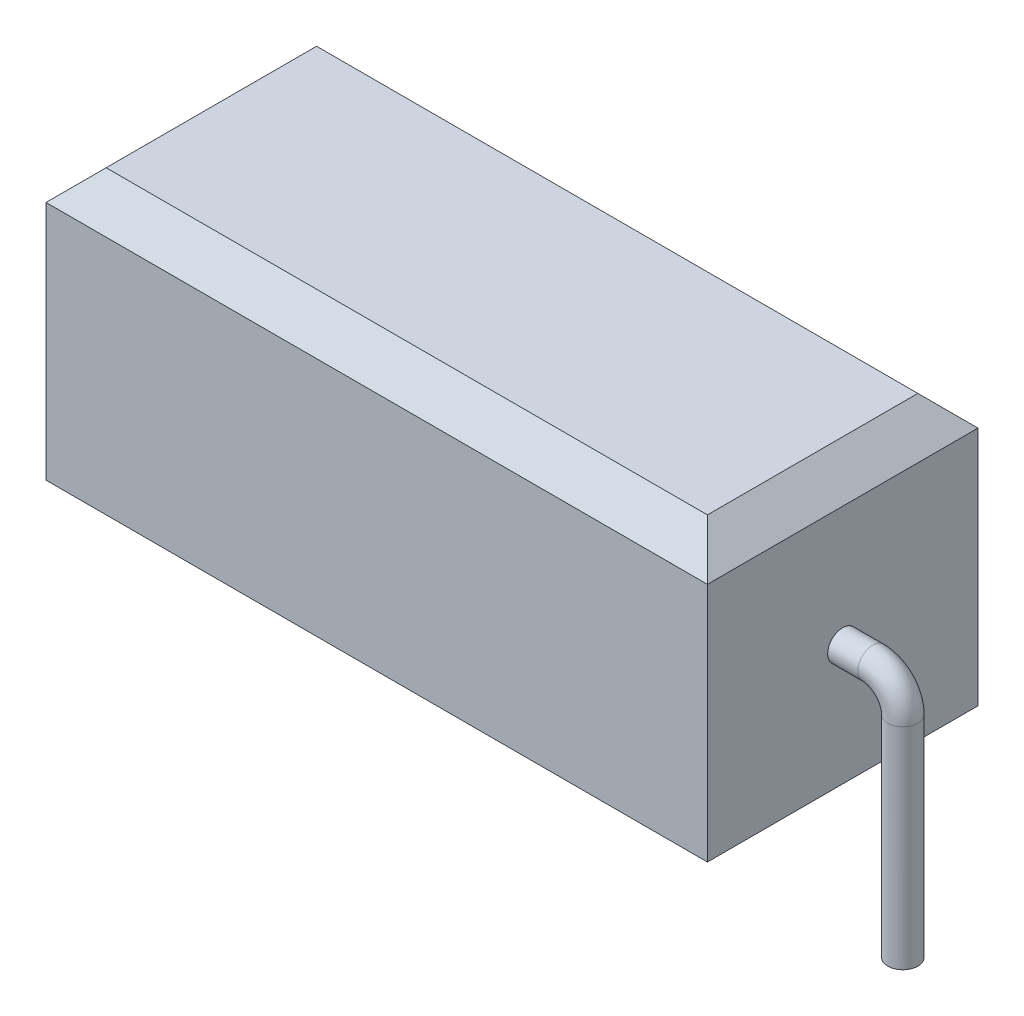
ISO-10303-21;
HEADER;
FILE_DESCRIPTION(('STEP AP214'),'2;1');
FILE_NAME('part.step','',(''),(''),'','','');
FILE_SCHEMA(('AUTOMOTIVE_DESIGN { 1 0 10303 214 1 1 1 1 }'));
ENDSEC;
DATA;
#1=APPLICATION_CONTEXT('core data for automotive mechanical design processes');
#2=APPLICATION_PROTOCOL_DEFINITION('international standard','automotive_design',2000,#1);
#3=PRODUCT_CONTEXT('',#1,'mechanical');
#4=PRODUCT('Part','Part','',(#3));
#5=PRODUCT_RELATED_PRODUCT_CATEGORY('part','',(#4));
#6=PRODUCT_DEFINITION_FORMATION('','',#4);
#7=PRODUCT_DEFINITION_CONTEXT('part definition',#1,'design');
#8=PRODUCT_DEFINITION('design','',#6,#7);
#9=PRODUCT_DEFINITION_SHAPE('','',#8);
#10=(LENGTH_UNIT() NAMED_UNIT(*) SI_UNIT(.MILLI.,.METRE.));
#11=(NAMED_UNIT(*) PLANE_ANGLE_UNIT() SI_UNIT($,.RADIAN.));
#12=(NAMED_UNIT(*) SI_UNIT($,.STERADIAN.) SOLID_ANGLE_UNIT());
#13=UNCERTAINTY_MEASURE_WITH_UNIT(LENGTH_MEASURE(1.E-05),#10,'distance_accuracy_value','');
#14=(GEOMETRIC_REPRESENTATION_CONTEXT(3) GLOBAL_UNCERTAINTY_ASSIGNED_CONTEXT((#13)) GLOBAL_UNIT_ASSIGNED_CONTEXT((#10,
#11,#12)) REPRESENTATION_CONTEXT('',''));
#15=CARTESIAN_POINT('',(0.,0.,0.));
#16=DIRECTION('',(0.,0.,1.));
#17=DIRECTION('',(1.,0.,0.));
#18=AXIS2_PLACEMENT_3D('',#15,#16,#17);
#19=CARTESIAN_POINT('',(11.,5.,4.5));
#20=DIRECTION('',(-1.,0.,0.));
#21=DIRECTION('',(0.,0.,1.));
#22=AXIS2_PLACEMENT_3D('',#19,#20,#21);
#23=PLANE('',#22);
#24=CARTESIAN_POINT('',(11.,0.,0.));
#25=DIRECTION('',(-1.,0.,0.));
#26=DIRECTION('',(0.,0.,1.));
#27=AXIS2_PLACEMENT_3D('',#24,#25,#26);
#28=CIRCLE('',#27,0.5);
#29=CARTESIAN_POINT('',(11.,0.,0.5));
#30=VERTEX_POINT('',#29);
#31=EDGE_CURVE('E76',#30,#30,#28,.F.);
#32=ORIENTED_EDGE('',*,*,#31,.F.);
#33=EDGE_LOOP('',(#32));
#34=FACE_BOUND('',#33,.T.);
#35=DIRECTION('',(0.,-1.,0.));
#36=VECTOR('',#35,1.);
#37=CARTESIAN_POINT('',(11.,5.,4.5));
#38=LINE('',#37,#36);
#39=CARTESIAN_POINT('',(11.,3.99999999999999,4.5));
#40=VERTEX_POINT('',#39);
#41=CARTESIAN_POINT('',(11.,-4.,4.5));
#42=VERTEX_POINT('',#41);
#43=EDGE_CURVE('E201',#40,#42,#38,.T.);
#44=ORIENTED_EDGE('',*,*,#43,.T.);
#45=DIRECTION('',(0.,0.,-1.));
#46=VECTOR('',#45,1.);
#47=CARTESIAN_POINT('',(11.,-4.,-4.5));
#48=LINE('',#47,#46);
#49=CARTESIAN_POINT('',(11.,-4.,-4.5));
#50=VERTEX_POINT('',#49);
#51=EDGE_CURVE('E217',#42,#50,#48,.T.);
#52=ORIENTED_EDGE('',*,*,#51,.T.);
#53=DIRECTION('',(0.,-1.,0.));
#54=VECTOR('',#53,1.);
#55=CARTESIAN_POINT('',(11.,5.,-4.5));
#56=LINE('',#55,#54);
#57=CARTESIAN_POINT('',(11.,3.99999999999999,-4.5));
#58=VERTEX_POINT('',#57);
#59=EDGE_CURVE('E157',#58,#50,#56,.T.);
#60=ORIENTED_EDGE('',*,*,#59,.F.);
#61=DIRECTION('',(0.,0.,1.));
#62=VECTOR('',#61,1.);
#63=CARTESIAN_POINT('',(11.,3.99999999999999,4.5));
#64=LINE('',#63,#62);
#65=EDGE_CURVE('E222',#58,#40,#64,.T.);
#66=ORIENTED_EDGE('',*,*,#65,.T.);
#67=EDGE_LOOP('',(#44,#52,#60,#66));
#68=FACE_BOUND('',#67,.T.);
#69=ADVANCED_FACE('F66',(#34,#68),#23,.F.);
#70=CARTESIAN_POINT('',(-11.,5.,-4.5));
#71=DIRECTION('',(0.,0.,1.));
#72=DIRECTION('',(1.,0.,0.));
#73=AXIS2_PLACEMENT_3D('',#70,#71,#72);
#74=PLANE('',#73);
#75=ORIENTED_EDGE('',*,*,#59,.T.);
#76=DIRECTION('',(-1.,0.,0.));
#77=VECTOR('',#76,1.);
#78=CARTESIAN_POINT('',(-11.,-4.,-4.5));
#79=LINE('',#78,#77);
#80=CARTESIAN_POINT('',(-11.,-4.,-4.5));
#81=VERTEX_POINT('',#80);
#82=EDGE_CURVE('E155',#50,#81,#79,.T.);
#83=ORIENTED_EDGE('',*,*,#82,.T.);
#84=DIRECTION('',(0.,-1.,0.));
#85=VECTOR('',#84,1.);
#86=CARTESIAN_POINT('',(-11.,5.,-4.5));
#87=LINE('',#86,#85);
#88=CARTESIAN_POINT('',(-11.,3.99999999999999,-4.5));
#89=VERTEX_POINT('',#88);
#90=EDGE_CURVE('E137',#89,#81,#87,.T.);
#91=ORIENTED_EDGE('',*,*,#90,.F.);
#92=DIRECTION('',(1.,0.,0.));
#93=VECTOR('',#92,1.);
#94=CARTESIAN_POINT('',(-11.,3.99999999999999,-4.5));
#95=LINE('',#94,#93);
#96=EDGE_CURVE('E152',#89,#58,#95,.T.);
#97=ORIENTED_EDGE('',*,*,#96,.T.);
#98=EDGE_LOOP('',(#75,#83,#91,#97));
#99=FACE_BOUND('',#98,.T.);
#100=ADVANCED_FACE('F151',(#99),#74,.F.);
#101=CARTESIAN_POINT('',(-11.,5.,4.5));
#102=DIRECTION('',(1.,0.,0.));
#103=DIRECTION('',(0.,0.,-1.));
#104=AXIS2_PLACEMENT_3D('',#101,#102,#103);
#105=PLANE('',#104);
#106=CARTESIAN_POINT('',(-11.,0.,0.));
#107=DIRECTION('',(1.,0.,0.));
#108=DIRECTION('',(0.,0.,-1.));
#109=AXIS2_PLACEMENT_3D('',#106,#107,#108);
#110=CIRCLE('',#109,0.5);
#111=CARTESIAN_POINT('',(-11.,0.,-0.5));
#112=VERTEX_POINT('',#111);
#113=EDGE_CURVE('E12',#112,#112,#110,.F.);
#114=ORIENTED_EDGE('',*,*,#113,.F.);
#115=EDGE_LOOP('',(#114));
#116=FACE_BOUND('',#115,.T.);
#117=ORIENTED_EDGE('',*,*,#90,.T.);
#118=DIRECTION('',(0.,0.,1.));
#119=VECTOR('',#118,1.);
#120=CARTESIAN_POINT('',(-11.,-4.,4.5));
#121=LINE('',#120,#119);
#122=CARTESIAN_POINT('',(-11.,-4.,4.5));
#123=VERTEX_POINT('',#122);
#124=EDGE_CURVE('E144',#81,#123,#121,.T.);
#125=ORIENTED_EDGE('',*,*,#124,.T.);
#126=DIRECTION('',(0.,-1.,0.));
#127=VECTOR('',#126,1.);
#128=CARTESIAN_POINT('',(-11.,5.,4.5));
#129=LINE('',#128,#127);
#130=CARTESIAN_POINT('',(-11.,3.99999999999999,4.5));
#131=VERTEX_POINT('',#130);
#132=EDGE_CURVE('E139',#131,#123,#129,.T.);
#133=ORIENTED_EDGE('',*,*,#132,.F.);
#134=DIRECTION('',(0.,0.,-1.));
#135=VECTOR('',#134,1.);
#136=CARTESIAN_POINT('',(-11.,3.99999999999999,4.5));
#137=LINE('',#136,#135);
#138=EDGE_CURVE('E134',#131,#89,#137,.T.);
#139=ORIENTED_EDGE('',*,*,#138,.T.);
#140=EDGE_LOOP('',(#117,#125,#133,#139));
#141=FACE_BOUND('',#140,.T.);
#142=ADVANCED_FACE('F136',(#116,#141),#105,.F.);
#143=CARTESIAN_POINT('',(-11.,5.,4.5));
#144=DIRECTION('',(0.,0.,-1.));
#145=DIRECTION('',(-1.,0.,0.));
#146=AXIS2_PLACEMENT_3D('',#143,#144,#145);
#147=PLANE('',#146);
#148=ORIENTED_EDGE('',*,*,#132,.T.);
#149=DIRECTION('',(1.,0.,0.));
#150=VECTOR('',#149,1.);
#151=CARTESIAN_POINT('',(11.,-4.,4.5));
#152=LINE('',#151,#150);
#153=EDGE_CURVE('E227',#123,#42,#152,.T.);
#154=ORIENTED_EDGE('',*,*,#153,.T.);
#155=ORIENTED_EDGE('',*,*,#43,.F.);
#156=DIRECTION('',(-1.,0.,0.));
#157=VECTOR('',#156,1.);
#158=CARTESIAN_POINT('',(-11.,3.99999999999999,4.5));
#159=LINE('',#158,#157);
#160=EDGE_CURVE('E210',#40,#131,#159,.T.);
#161=ORIENTED_EDGE('',*,*,#160,.T.);
#162=EDGE_LOOP('',(#148,#154,#155,#161));
#163=FACE_BOUND('',#162,.T.);
#164=ADVANCED_FACE('F375',(#163),#147,.F.);
#165=CARTESIAN_POINT('',(0.,5.,0.));
#166=DIRECTION('',(0.,-1.,0.));
#167=DIRECTION('',(0.,0.,-1.));
#168=AXIS2_PLACEMENT_3D('',#165,#166,#167);
#169=PLANE('',#168);
#170=DIRECTION('',(0.,0.,1.));
#171=VECTOR('',#170,1.);
#172=CARTESIAN_POINT('',(-9.99999999999999,5.,0.));
#173=LINE('',#172,#171);
#174=CARTESIAN_POINT('',(-9.99999999999999,5.,-3.5));
#175=VERTEX_POINT('',#174);
#176=CARTESIAN_POINT('',(-9.99999999999999,5.,3.49999999999999));
#177=VERTEX_POINT('',#176);
#178=EDGE_CURVE('E83',#175,#177,#173,.T.);
#179=ORIENTED_EDGE('',*,*,#178,.T.);
#180=DIRECTION('',(1.,0.,0.));
#181=VECTOR('',#180,1.);
#182=CARTESIAN_POINT('',(0.,5.,3.49999999999999));
#183=LINE('',#182,#181);
#184=CARTESIAN_POINT('',(10.,5.,3.49999999999999));
#185=VERTEX_POINT('',#184);
#186=EDGE_CURVE('E181',#177,#185,#183,.T.);
#187=ORIENTED_EDGE('',*,*,#186,.T.);
#188=DIRECTION('',(0.,0.,-1.));
#189=VECTOR('',#188,1.);
#190=CARTESIAN_POINT('',(10.,5.,0.));
#191=LINE('',#190,#189);
#192=CARTESIAN_POINT('',(10.,5.,-3.5));
#193=VERTEX_POINT('',#192);
#194=EDGE_CURVE('E214',#185,#193,#191,.T.);
#195=ORIENTED_EDGE('',*,*,#194,.T.);
#196=DIRECTION('',(-1.,0.,0.));
#197=VECTOR('',#196,1.);
#198=CARTESIAN_POINT('',(0.,5.,-3.5));
#199=LINE('',#198,#197);
#200=EDGE_CURVE('E88',#193,#175,#199,.T.);
#201=ORIENTED_EDGE('',*,*,#200,.T.);
#202=EDGE_LOOP('',(#179,#187,#195,#201));
#203=FACE_BOUND('',#202,.T.);
#204=ADVANCED_FACE('F368',(#203),#169,.F.);
#205=CARTESIAN_POINT('',(0.,-5.,0.));
#206=DIRECTION('',(0.,-1.,0.));
#207=DIRECTION('',(0.,0.,-1.));
#208=AXIS2_PLACEMENT_3D('',#205,#206,#207);
#209=PLANE('',#208);
#210=DIRECTION('',(0.,0.,-1.));
#211=VECTOR('',#210,1.);
#212=CARTESIAN_POINT('',(-9.99999999999999,-5.,-4.5));
#213=LINE('',#212,#211);
#214=CARTESIAN_POINT('',(-9.99999999999999,-5.,3.49999999999999));
#215=VERTEX_POINT('',#214);
#216=CARTESIAN_POINT('',(-9.99999999999999,-5.,-3.5));
#217=VERTEX_POINT('',#216);
#218=EDGE_CURVE('E237',#215,#217,#213,.T.);
#219=ORIENTED_EDGE('',*,*,#218,.T.);
#220=DIRECTION('',(1.,0.,0.));
#221=VECTOR('',#220,1.);
#222=CARTESIAN_POINT('',(11.,-5.,-3.5));
#223=LINE('',#222,#221);
#224=CARTESIAN_POINT('',(10.,-5.,-3.5));
#225=VERTEX_POINT('',#224);
#226=EDGE_CURVE('E145',#217,#225,#223,.T.);
#227=ORIENTED_EDGE('',*,*,#226,.T.);
#228=DIRECTION('',(0.,0.,1.));
#229=VECTOR('',#228,1.);
#230=CARTESIAN_POINT('',(10.,-5.,4.5));
#231=LINE('',#230,#229);
#232=CARTESIAN_POINT('',(10.,-5.,3.49999999999999));
#233=VERTEX_POINT('',#232);
#234=EDGE_CURVE('E243',#225,#233,#231,.T.);
#235=ORIENTED_EDGE('',*,*,#234,.T.);
#236=DIRECTION('',(-1.,0.,0.));
#237=VECTOR('',#236,1.);
#238=CARTESIAN_POINT('',(-11.,-5.,3.49999999999999));
#239=LINE('',#238,#237);
#240=EDGE_CURVE('E240',#233,#215,#239,.T.);
#241=ORIENTED_EDGE('',*,*,#240,.T.);
#242=EDGE_LOOP('',(#219,#227,#235,#241));
#243=FACE_BOUND('',#242,.T.);
#244=ADVANCED_FACE('F330',(#243),#209,.T.);
#245=CARTESIAN_POINT('',(-11.,-4.,4.5));
#246=DIRECTION('',(0.,-0.707106781186549,0.707106781186546));
#247=DIRECTION('',(-1.,0.,0.));
#248=AXIS2_PLACEMENT_3D('',#245,#246,#247);
#249=PLANE('',#248);
#250=DIRECTION('',(0.577350269189626,-0.577350269189624,-0.577350269189626));
#251=VECTOR('',#250,1.);
#252=CARTESIAN_POINT('',(-11.,-4.,4.5));
#253=LINE('',#252,#251);
#254=EDGE_CURVE('E193',#215,#123,#253,.F.);
#255=ORIENTED_EDGE('',*,*,#254,.F.);
#256=ORIENTED_EDGE('',*,*,#240,.F.);
#257=DIRECTION('',(-0.577350269189626,-0.577350269189624,-0.577350269189626));
#258=VECTOR('',#257,1.);
#259=CARTESIAN_POINT('',(11.,-4.,4.5));
#260=LINE('',#259,#258);
#261=EDGE_CURVE('E197',#42,#233,#260,.T.);
#262=ORIENTED_EDGE('',*,*,#261,.F.);
#263=ORIENTED_EDGE('',*,*,#153,.F.);
#264=EDGE_LOOP('',(#255,#256,#262,#263));
#265=FACE_BOUND('',#264,.T.);
#266=ADVANCED_FACE('F324',(#265),#249,.T.);
#267=CARTESIAN_POINT('',(11.,-4.,4.5));
#268=DIRECTION('',(0.707106781186546,-0.707106781186549,0.));
#269=DIRECTION('',(0.,0.,1.));
#270=AXIS2_PLACEMENT_3D('',#267,#268,#269);
#271=PLANE('',#270);
#272=ORIENTED_EDGE('',*,*,#261,.T.);
#273=ORIENTED_EDGE('',*,*,#234,.F.);
#274=DIRECTION('',(0.577350269189626,0.577350269189624,-0.577350269189626));
#275=VECTOR('',#274,1.);
#276=CARTESIAN_POINT('',(7.99999999999999,-7.,-1.49999999999999));
#277=LINE('',#276,#275);
#278=EDGE_CURVE('E174',#50,#225,#277,.F.);
#279=ORIENTED_EDGE('',*,*,#278,.F.);
#280=ORIENTED_EDGE('',*,*,#51,.F.);
#281=EDGE_LOOP('',(#272,#273,#279,#280));
#282=FACE_BOUND('',#281,.T.);
#283=ADVANCED_FACE('F317',(#282),#271,.T.);
#284=CARTESIAN_POINT('',(-11.,-4.,4.5));
#285=DIRECTION('',(-0.707106781186546,-0.707106781186549,0.));
#286=DIRECTION('',(0.,0.,-1.));
#287=AXIS2_PLACEMENT_3D('',#284,#285,#286);
#288=PLANE('',#287);
#289=ORIENTED_EDGE('',*,*,#254,.T.);
#290=ORIENTED_EDGE('',*,*,#124,.F.);
#291=DIRECTION('',(0.577350269189626,-0.577350269189624,0.577350269189626));
#292=VECTOR('',#291,1.);
#293=CARTESIAN_POINT('',(-7.99999999999999,-7.,-1.49999999999999));
#294=LINE('',#293,#292);
#295=EDGE_CURVE('E169',#217,#81,#294,.F.);
#296=ORIENTED_EDGE('',*,*,#295,.F.);
#297=ORIENTED_EDGE('',*,*,#218,.F.);
#298=EDGE_LOOP('',(#289,#290,#296,#297));
#299=FACE_BOUND('',#298,.T.);
#300=ADVANCED_FACE('F310',(#299),#288,.T.);
#301=CARTESIAN_POINT('',(-11.,-4.,-4.5));
#302=DIRECTION('',(0.,-0.707106781186549,-0.707106781186546));
#303=DIRECTION('',(1.,0.,0.));
#304=AXIS2_PLACEMENT_3D('',#301,#302,#303);
#305=PLANE('',#304);
#306=ORIENTED_EDGE('',*,*,#278,.T.);
#307=ORIENTED_EDGE('',*,*,#226,.F.);
#308=ORIENTED_EDGE('',*,*,#295,.T.);
#309=ORIENTED_EDGE('',*,*,#82,.F.);
#310=EDGE_LOOP('',(#306,#307,#308,#309));
#311=FACE_BOUND('',#310,.T.);
#312=ADVANCED_FACE('F304',(#311),#305,.T.);
#313=CARTESIAN_POINT('',(0.,5.,-3.5));
#314=DIRECTION('',(0.,-0.707106781186546,0.707106781186549));
#315=DIRECTION('',(-1.,0.,0.));
#316=AXIS2_PLACEMENT_3D('',#313,#314,#315);
#317=PLANE('',#316);
#318=DIRECTION('',(-0.577350269189625,0.577350269189627,0.577350269189625));
#319=VECTOR('',#318,1.);
#320=CARTESIAN_POINT('',(8.83333333333333,6.16666666666667,-2.33333333333333));
#321=LINE('',#320,#319);
#322=EDGE_CURVE('E163',#58,#193,#321,.T.);
#323=ORIENTED_EDGE('',*,*,#322,.F.);
#324=ORIENTED_EDGE('',*,*,#96,.F.);
#325=DIRECTION('',(0.577350269189625,0.577350269189627,0.577350269189625));
#326=VECTOR('',#325,1.);
#327=CARTESIAN_POINT('',(-6.66666666666667,8.33333333333334,-0.166666666666673));
#328=LINE('',#327,#326);
#329=EDGE_CURVE('E161',#175,#89,#328,.F.);
#330=ORIENTED_EDGE('',*,*,#329,.F.);
#331=ORIENTED_EDGE('',*,*,#200,.F.);
#332=EDGE_LOOP('',(#323,#324,#330,#331));
#333=FACE_BOUND('',#332,.T.);
#334=ADVANCED_FACE('F69',(#333),#317,.F.);
#335=CARTESIAN_POINT('',(-9.99999999999999,5.,0.));
#336=DIRECTION('',(0.707106781186549,-0.707106781186546,0.));
#337=DIRECTION('',(0.,0.,1.));
#338=AXIS2_PLACEMENT_3D('',#335,#336,#337);
#339=PLANE('',#338);
#340=ORIENTED_EDGE('',*,*,#329,.T.);
#341=ORIENTED_EDGE('',*,*,#138,.F.);
#342=DIRECTION('',(0.577350269189625,0.577350269189627,-0.577350269189625));
#343=VECTOR('',#342,1.);
#344=CARTESIAN_POINT('',(-8.83333333333333,6.16666666666667,2.33333333333333));
#345=LINE('',#344,#343);
#346=EDGE_CURVE('E176',#177,#131,#345,.F.);
#347=ORIENTED_EDGE('',*,*,#346,.F.);
#348=ORIENTED_EDGE('',*,*,#178,.F.);
#349=EDGE_LOOP('',(#340,#341,#347,#348));
#350=FACE_BOUND('',#349,.T.);
#351=ADVANCED_FACE('F167',(#350),#339,.F.);
#352=CARTESIAN_POINT('',(10.,5.,0.));
#353=DIRECTION('',(-0.707106781186549,-0.707106781186546,0.));
#354=DIRECTION('',(0.,0.,-1.));
#355=AXIS2_PLACEMENT_3D('',#352,#353,#354);
#356=PLANE('',#355);
#357=ORIENTED_EDGE('',*,*,#322,.T.);
#358=ORIENTED_EDGE('',*,*,#194,.F.);
#359=DIRECTION('',(0.577350269189625,-0.577350269189627,0.577350269189625));
#360=VECTOR('',#359,1.);
#361=CARTESIAN_POINT('',(8.83333333333334,6.16666666666667,2.33333333333333));
#362=LINE('',#361,#360);
#363=EDGE_CURVE('E202',#40,#185,#362,.F.);
#364=ORIENTED_EDGE('',*,*,#363,.F.);
#365=ORIENTED_EDGE('',*,*,#65,.F.);
#366=EDGE_LOOP('',(#357,#358,#364,#365));
#367=FACE_BOUND('',#366,.T.);
#368=ADVANCED_FACE('F215',(#367),#356,.F.);
#369=CARTESIAN_POINT('',(0.,5.,3.49999999999999));
#370=DIRECTION('',(0.,-0.707106781186546,-0.707106781186549));
#371=DIRECTION('',(1.,0.,0.));
#372=AXIS2_PLACEMENT_3D('',#369,#370,#371);
#373=PLANE('',#372);
#374=ORIENTED_EDGE('',*,*,#346,.T.);
#375=ORIENTED_EDGE('',*,*,#160,.F.);
#376=ORIENTED_EDGE('',*,*,#363,.T.);
#377=ORIENTED_EDGE('',*,*,#186,.F.);
#378=EDGE_LOOP('',(#374,#375,#376,#377));
#379=FACE_BOUND('',#378,.T.);
#380=ADVANCED_FACE('F209',(#379),#373,.F.);
#381=CARTESIAN_POINT('',(13.,-8.,0.));
#382=DIRECTION('',(0.,1.,0.));
#383=DIRECTION('',(0.,0.,1.));
#384=AXIS2_PLACEMENT_3D('',#381,#382,#383);
#385=PLANE('',#384);
#386=CARTESIAN_POINT('',(13.,-8.,0.));
#387=DIRECTION('',(0.,1.,0.));
#388=DIRECTION('',(0.,0.,1.));
#389=AXIS2_PLACEMENT_3D('',#386,#387,#388);
#390=CIRCLE('',#389,0.5);
#391=CARTESIAN_POINT('',(13.,-8.,0.5));
#392=VERTEX_POINT('',#391);
#393=EDGE_CURVE('E204',#392,#392,#390,.T.);
#394=ORIENTED_EDGE('',*,*,#393,.F.);
#395=EDGE_LOOP('',(#394));
#396=FACE_BOUND('',#395,.T.);
#397=ADVANCED_FACE('F290',(#396),#385,.F.);
#398=CARTESIAN_POINT('',(11.,0.,0.));
#399=DIRECTION('',(1.,0.,0.));
#400=DIRECTION('',(0.,1.,0.));
#401=AXIS2_PLACEMENT_3D('',#398,#399,#400);
#402=CYLINDRICAL_SURFACE('',#401,0.5);
#403=CARTESIAN_POINT('',(12.,0.,0.));
#404=DIRECTION('',(-1.,0.,0.));
#405=DIRECTION('',(0.,0.,1.));
#406=AXIS2_PLACEMENT_3D('',#403,#404,#405);
#407=CIRCLE('',#406,0.5);
#408=CARTESIAN_POINT('',(12.,0.499999999999999,0.));
#409=VERTEX_POINT('',#408);
#410=EDGE_CURVE('E259',#409,#409,#407,.T.);
#411=ORIENTED_EDGE('',*,*,#410,.T.);
#412=EDGE_LOOP('',(#411));
#413=FACE_BOUND('',#412,.T.);
#414=ORIENTED_EDGE('',*,*,#31,.T.);
#415=EDGE_LOOP('',(#414));
#416=FACE_BOUND('',#415,.T.);
#417=ADVANCED_FACE('F409',(#413,#416),#402,.T.);
#418=CARTESIAN_POINT('',(12.,-1.,0.));
#419=DIRECTION('',(0.,0.,-1.));
#420=DIRECTION('',(-1.,0.,0.));
#421=AXIS2_PLACEMENT_3D('',#418,#419,#420);
#422=TOROIDAL_SURFACE('',#421,1.,0.5);
#423=CARTESIAN_POINT('',(13.0000000000001,-0.999999999999925,0.));
#424=DIRECTION('',(0.,1.,0.));
#425=DIRECTION('',(0.,0.,1.));
#426=AXIS2_PLACEMENT_3D('',#423,#424,#425);
#427=CIRCLE('',#426,0.5);
#428=CARTESIAN_POINT('',(13.5,-0.999999999999886,0.));
#429=VERTEX_POINT('',#428);
#430=EDGE_CURVE('E256',#429,#429,#427,.T.);
#431=CARTESIAN_POINT('',(12.,-1.,0.));
#432=DIRECTION('',(0.,0.,-1.));
#433=DIRECTION('',(-1.,0.,0.));
#434=AXIS2_PLACEMENT_3D('',#431,#432,#433);
#435=CIRCLE('',#434,1.5);
#436=EDGE_CURVE('',#409,#429,#435,.T.);
#437=ORIENTED_EDGE('',*,*,#410,.F.);
#438=ORIENTED_EDGE('',*,*,#430,.T.);
#439=ORIENTED_EDGE('',*,*,#436,.T.);
#440=ORIENTED_EDGE('',*,*,#436,.F.);
#441=EDGE_LOOP('',(#437,#439,#438,#440));
#442=FACE_BOUND('',#441,.T.);
#443=ADVANCED_FACE('F419',(#442),#422,.T.);
#444=CARTESIAN_POINT('',(13.,-1.00000000000001,0.));
#445=DIRECTION('',(0.,-1.,0.));
#446=DIRECTION('',(1.,0.,0.));
#447=AXIS2_PLACEMENT_3D('',#444,#445,#446);
#448=CYLINDRICAL_SURFACE('',#447,0.5);
#449=ORIENTED_EDGE('',*,*,#393,.T.);
#450=EDGE_LOOP('',(#449));
#451=FACE_BOUND('',#450,.T.);
#452=ORIENTED_EDGE('',*,*,#430,.F.);
#453=EDGE_LOOP('',(#452));
#454=FACE_BOUND('',#453,.T.);
#455=ADVANCED_FACE('F338',(#451,#454),#448,.T.);
#456=CARTESIAN_POINT('',(-13.,-8.,0.));
#457=DIRECTION('',(0.,1.,0.));
#458=DIRECTION('',(-1.,0.,0.));
#459=AXIS2_PLACEMENT_3D('',#456,#457,#458);
#460=PLANE('',#459);
#461=CARTESIAN_POINT('',(-13.,-8.,0.));
#462=DIRECTION('',(0.,1.,0.));
#463=DIRECTION('',(-1.,0.,0.));
#464=AXIS2_PLACEMENT_3D('',#461,#462,#463);
#465=CIRCLE('',#464,0.5);
#466=CARTESIAN_POINT('',(-13.5,-8.,0.));
#467=VERTEX_POINT('',#466);
#468=EDGE_CURVE('E263',#467,#467,#465,.T.);
#469=ORIENTED_EDGE('',*,*,#468,.F.);
#470=EDGE_LOOP('',(#469));
#471=FACE_BOUND('',#470,.T.);
#472=ADVANCED_FACE('F291',(#471),#460,.F.);
#473=CARTESIAN_POINT('',(-11.,0.,0.));
#474=DIRECTION('',(-1.,0.,0.));
#475=DIRECTION('',(0.,-1.,0.));
#476=AXIS2_PLACEMENT_3D('',#473,#474,#475);
#477=CYLINDRICAL_SURFACE('',#476,0.5);
#478=CARTESIAN_POINT('',(-12.,0.,0.));
#479=DIRECTION('',(1.,0.,0.));
#480=DIRECTION('',(0.,1.,0.));
#481=AXIS2_PLACEMENT_3D('',#478,#479,#480);
#482=CIRCLE('',#481,0.5);
#483=CARTESIAN_POINT('',(-12.,0.499999999999999,0.));
#484=VERTEX_POINT('',#483);
#485=EDGE_CURVE('E271',#484,#484,#482,.T.);
#486=ORIENTED_EDGE('',*,*,#485,.T.);
#487=EDGE_LOOP('',(#486));
#488=FACE_BOUND('',#487,.T.);
#489=ORIENTED_EDGE('',*,*,#113,.T.);
#490=EDGE_LOOP('',(#489));
#491=FACE_BOUND('',#490,.T.);
#492=ADVANCED_FACE('F276',(#488,#491),#477,.T.);
#493=CARTESIAN_POINT('',(-12.,-1.,0.));
#494=DIRECTION('',(0.,0.,1.));
#495=DIRECTION('',(1.,0.,0.));
#496=AXIS2_PLACEMENT_3D('',#493,#494,#495);
#497=TOROIDAL_SURFACE('',#496,1.,0.5);
#498=CARTESIAN_POINT('',(-13.,-0.999999999999926,0.));
#499=DIRECTION('',(0.,1.,0.));
#500=DIRECTION('',(-1.,0.,0.));
#501=AXIS2_PLACEMENT_3D('',#498,#499,#500);
#502=CIRCLE('',#501,0.5);
#503=CARTESIAN_POINT('',(-13.5,-0.999999999999889,0.));
#504=VERTEX_POINT('',#503);
#505=EDGE_CURVE('E267',#504,#504,#502,.T.);
#506=CARTESIAN_POINT('',(-12.,-1.,0.));
#507=DIRECTION('',(0.,0.,1.));
#508=DIRECTION('',(1.,0.,0.));
#509=AXIS2_PLACEMENT_3D('',#506,#507,#508);
#510=CIRCLE('',#509,1.5);
#511=EDGE_CURVE('',#484,#504,#510,.T.);
#512=ORIENTED_EDGE('',*,*,#485,.F.);
#513=ORIENTED_EDGE('',*,*,#505,.T.);
#514=ORIENTED_EDGE('',*,*,#511,.T.);
#515=ORIENTED_EDGE('',*,*,#511,.F.);
#516=EDGE_LOOP('',(#512,#514,#513,#515));
#517=FACE_BOUND('',#516,.T.);
#518=ADVANCED_FACE('F279',(#517),#497,.T.);
#519=CARTESIAN_POINT('',(-13.,-1.00000000000001,0.));
#520=DIRECTION('',(0.,-1.,0.));
#521=DIRECTION('',(1.,0.,0.));
#522=AXIS2_PLACEMENT_3D('',#519,#520,#521);
#523=CYLINDRICAL_SURFACE('',#522,0.5);
#524=ORIENTED_EDGE('',*,*,#468,.T.);
#525=EDGE_LOOP('',(#524));
#526=FACE_BOUND('',#525,.T.);
#527=ORIENTED_EDGE('',*,*,#505,.F.);
#528=EDGE_LOOP('',(#527));
#529=FACE_BOUND('',#528,.T.);
#530=ADVANCED_FACE('F281',(#526,#529),#523,.T.);
#531=CLOSED_SHELL('',(#69,#100,#142,#164,#204,#244,#266,#283,#300,#312,#334,#351,#368,#380,#397,
#417,#443,#455,#472,#492,#518,#530));
#532=MANIFOLD_SOLID_BREP('B2',#531);
#533=ADVANCED_BREP_SHAPE_REPRESENTATION('',(#18,#532),#14);
#534=SHAPE_DEFINITION_REPRESENTATION(#9,#533);
ENDSEC;
END-ISO-10303-21;
